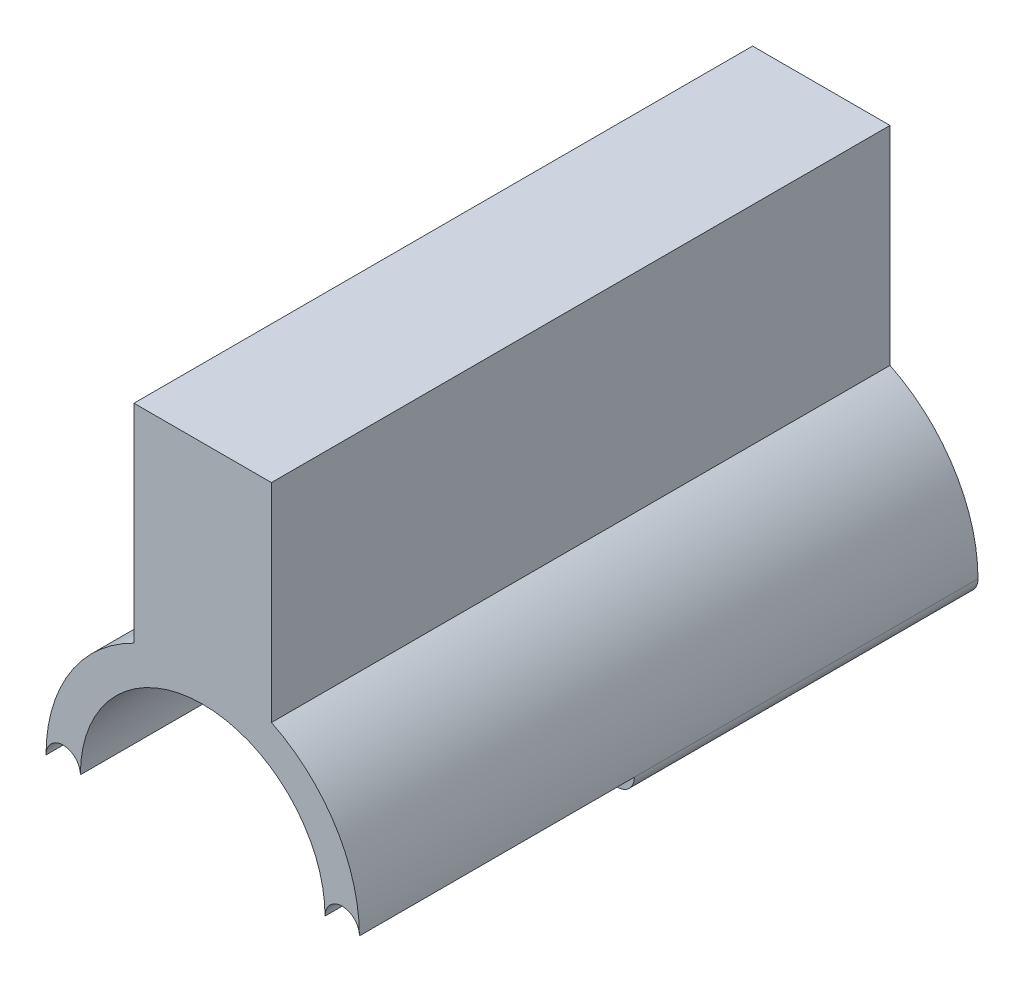
ISO-10303-21;
HEADER;
FILE_DESCRIPTION(('STEP AP214'),'2;1');
FILE_NAME('part.step','',(''),(''),'','','');
FILE_SCHEMA(('AUTOMOTIVE_DESIGN { 1 0 10303 214 1 1 1 1 }'));
ENDSEC;
DATA;
#1=APPLICATION_CONTEXT('core data for automotive mechanical design processes');
#2=APPLICATION_PROTOCOL_DEFINITION('international standard','automotive_design',2000,#1);
#3=PRODUCT_CONTEXT('',#1,'mechanical');
#4=PRODUCT('Part','Part','',(#3));
#5=PRODUCT_RELATED_PRODUCT_CATEGORY('part','',(#4));
#6=PRODUCT_DEFINITION_FORMATION('','',#4);
#7=PRODUCT_DEFINITION_CONTEXT('part definition',#1,'design');
#8=PRODUCT_DEFINITION('design','',#6,#7);
#9=PRODUCT_DEFINITION_SHAPE('','',#8);
#10=(LENGTH_UNIT() NAMED_UNIT(*) SI_UNIT(.MILLI.,.METRE.));
#11=(NAMED_UNIT(*) PLANE_ANGLE_UNIT() SI_UNIT($,.RADIAN.));
#12=(NAMED_UNIT(*) SI_UNIT($,.STERADIAN.) SOLID_ANGLE_UNIT());
#13=UNCERTAINTY_MEASURE_WITH_UNIT(LENGTH_MEASURE(1.E-05),#10,'distance_accuracy_value','');
#14=(GEOMETRIC_REPRESENTATION_CONTEXT(3) GLOBAL_UNCERTAINTY_ASSIGNED_CONTEXT((#13)) GLOBAL_UNIT_ASSIGNED_CONTEXT((#10,
#11,#12)) REPRESENTATION_CONTEXT('',''));
#15=CARTESIAN_POINT('',(0.,0.,0.));
#16=DIRECTION('',(0.,0.,1.));
#17=DIRECTION('',(1.,0.,0.));
#18=AXIS2_PLACEMENT_3D('',#15,#16,#17);
#19=CARTESIAN_POINT('',(-101.5,0.,450.));
#20=DIRECTION('',(0.,0.,-1.));
#21=DIRECTION('',(-1.,0.,0.));
#22=AXIS2_PLACEMENT_3D('',#19,#20,#21);
#23=CYLINDRICAL_SURFACE('',#22,12.5);
#24=CARTESIAN_POINT('',(-101.5,0.,250.));
#25=DIRECTION('',(0.,0.,1.));
#26=DIRECTION('',(1.,0.,0.));
#27=AXIS2_PLACEMENT_3D('',#24,#25,#26);
#28=CIRCLE('',#27,12.5);
#29=CARTESIAN_POINT('',(-114.,0.,250.));
#30=VERTEX_POINT('',#29);
#31=CARTESIAN_POINT('',(-89.,0.,250.));
#32=VERTEX_POINT('',#31);
#33=EDGE_CURVE('E185',#30,#32,#28,.T.);
#34=ORIENTED_EDGE('',*,*,#33,.F.);
#35=DIRECTION('',(0.,0.,-1.));
#36=VECTOR('',#35,1.);
#37=CARTESIAN_POINT('',(-114.,0.,450.));
#38=LINE('',#37,#36);
#39=CARTESIAN_POINT('',(-114.,0.,0.));
#40=VERTEX_POINT('',#39);
#41=EDGE_CURVE('E169',#30,#40,#38,.T.);
#42=ORIENTED_EDGE('',*,*,#41,.T.);
#43=CARTESIAN_POINT('',(-101.5,0.,0.));
#44=DIRECTION('',(0.,0.,1.));
#45=DIRECTION('',(1.,0.,0.));
#46=AXIS2_PLACEMENT_3D('',#43,#44,#45);
#47=CIRCLE('',#46,12.5);
#48=CARTESIAN_POINT('',(-89.,0.,0.));
#49=VERTEX_POINT('',#48);
#50=EDGE_CURVE('E143',#40,#49,#47,.T.);
#51=ORIENTED_EDGE('',*,*,#50,.T.);
#52=DIRECTION('',(0.,0.,-1.));
#53=VECTOR('',#52,1.);
#54=CARTESIAN_POINT('',(-89.,0.,450.));
#55=LINE('',#54,#53);
#56=EDGE_CURVE('E164',#32,#49,#55,.T.);
#57=ORIENTED_EDGE('',*,*,#56,.F.);
#58=EDGE_LOOP('',(#34,#42,#51,#57));
#59=FACE_BOUND('',#58,.T.);
#60=ADVANCED_FACE('F41',(#59),#23,.T.);
#61=CARTESIAN_POINT('',(101.5,0.,450.));
#62=DIRECTION('',(0.,0.,-1.));
#63=DIRECTION('',(-1.,0.,0.));
#64=AXIS2_PLACEMENT_3D('',#61,#62,#63);
#65=CYLINDRICAL_SURFACE('',#64,12.5);
#66=CARTESIAN_POINT('',(101.5,0.,250.));
#67=DIRECTION('',(0.,0.,1.));
#68=DIRECTION('',(1.,0.,0.));
#69=AXIS2_PLACEMENT_3D('',#66,#67,#68);
#70=CIRCLE('',#69,12.5);
#71=CARTESIAN_POINT('',(89.,0.,250.));
#72=VERTEX_POINT('',#71);
#73=CARTESIAN_POINT('',(114.,0.,250.));
#74=VERTEX_POINT('',#73);
#75=EDGE_CURVE('E208',#72,#74,#70,.T.);
#76=ORIENTED_EDGE('',*,*,#75,.F.);
#77=DIRECTION('',(0.,0.,-1.));
#78=VECTOR('',#77,1.);
#79=CARTESIAN_POINT('',(89.,0.,450.));
#80=LINE('',#79,#78);
#81=CARTESIAN_POINT('',(89.,0.,0.));
#82=VERTEX_POINT('',#81);
#83=EDGE_CURVE('E161',#72,#82,#80,.T.);
#84=ORIENTED_EDGE('',*,*,#83,.T.);
#85=CARTESIAN_POINT('',(101.5,0.,0.));
#86=DIRECTION('',(0.,0.,1.));
#87=DIRECTION('',(1.,0.,0.));
#88=AXIS2_PLACEMENT_3D('',#85,#86,#87);
#89=CIRCLE('',#88,12.5);
#90=CARTESIAN_POINT('',(114.,0.,0.));
#91=VERTEX_POINT('',#90);
#92=EDGE_CURVE('E150',#82,#91,#89,.T.);
#93=ORIENTED_EDGE('',*,*,#92,.T.);
#94=DIRECTION('',(0.,0.,-1.));
#95=VECTOR('',#94,1.);
#96=CARTESIAN_POINT('',(114.,0.,450.));
#97=LINE('',#96,#95);
#98=EDGE_CURVE('E130',#74,#91,#97,.T.);
#99=ORIENTED_EDGE('',*,*,#98,.F.);
#100=EDGE_LOOP('',(#76,#84,#93,#99));
#101=FACE_BOUND('',#100,.T.);
#102=ADVANCED_FACE('F217',(#101),#65,.T.);
#103=CARTESIAN_POINT('',(-50.,0.,450.));
#104=DIRECTION('',(-1.,0.,0.));
#105=DIRECTION('',(0.,0.,1.));
#106=AXIS2_PLACEMENT_3D('',#103,#104,#105);
#107=PLANE('',#106);
#108=DIRECTION('',(0.,1.,0.));
#109=VECTOR('',#108,1.);
#110=CARTESIAN_POINT('',(-50.,0.,0.));
#111=LINE('',#110,#109);
#112=CARTESIAN_POINT('',(-50.,102.449987798926,0.));
#113=VERTEX_POINT('',#112);
#114=CARTESIAN_POINT('',(-50.,253.6274405368,0.));
#115=VERTEX_POINT('',#114);
#116=EDGE_CURVE('E135',#113,#115,#111,.T.);
#117=ORIENTED_EDGE('',*,*,#116,.F.);
#118=DIRECTION('',(0.,0.,-1.));
#119=VECTOR('',#118,1.);
#120=CARTESIAN_POINT('',(-50.,102.449987798926,450.));
#121=LINE('',#120,#119);
#122=CARTESIAN_POINT('',(-50.,102.449987798926,450.));
#123=VERTEX_POINT('',#122);
#124=EDGE_CURVE('E11',#123,#113,#121,.T.);
#125=ORIENTED_EDGE('',*,*,#124,.F.);
#126=DIRECTION('',(0.,1.,0.));
#127=VECTOR('',#126,1.);
#128=CARTESIAN_POINT('',(-50.,0.,450.));
#129=LINE('',#128,#127);
#130=CARTESIAN_POINT('',(-50.,253.6274405368,450.));
#131=VERTEX_POINT('',#130);
#132=EDGE_CURVE('E156',#123,#131,#129,.T.);
#133=ORIENTED_EDGE('',*,*,#132,.T.);
#134=DIRECTION('',(0.,0.,-1.));
#135=VECTOR('',#134,1.);
#136=CARTESIAN_POINT('',(-50.,253.6274405368,450.));
#137=LINE('',#136,#135);
#138=EDGE_CURVE('E59',#131,#115,#137,.T.);
#139=ORIENTED_EDGE('',*,*,#138,.T.);
#140=EDGE_LOOP('',(#117,#125,#133,#139));
#141=FACE_BOUND('',#140,.T.);
#142=ADVANCED_FACE('F43',(#141),#107,.T.);
#143=CARTESIAN_POINT('',(0.,0.,450.));
#144=DIRECTION('',(0.,0.,-1.));
#145=DIRECTION('',(-1.,0.,0.));
#146=AXIS2_PLACEMENT_3D('',#143,#144,#145);
#147=CYLINDRICAL_SURFACE('',#146,114.);
#148=CARTESIAN_POINT('',(0.,0.,0.));
#149=DIRECTION('',(0.,0.,1.));
#150=DIRECTION('',(1.,0.,0.));
#151=AXIS2_PLACEMENT_3D('',#148,#149,#150);
#152=CIRCLE('',#151,114.);
#153=EDGE_CURVE('E140',#113,#40,#152,.T.);
#154=ORIENTED_EDGE('',*,*,#153,.T.);
#155=ORIENTED_EDGE('',*,*,#41,.F.);
#156=CARTESIAN_POINT('',(-114.,0.,450.));
#157=VERTEX_POINT('',#156);
#158=EDGE_CURVE('E49',#157,#30,#38,.T.);
#159=ORIENTED_EDGE('',*,*,#158,.F.);
#160=CARTESIAN_POINT('',(0.,0.,450.));
#161=DIRECTION('',(0.,0.,1.));
#162=DIRECTION('',(1.,0.,0.));
#163=AXIS2_PLACEMENT_3D('',#160,#161,#162);
#164=CIRCLE('',#163,114.);
#165=EDGE_CURVE('E231',#123,#157,#164,.T.);
#166=ORIENTED_EDGE('',*,*,#165,.F.);
#167=ORIENTED_EDGE('',*,*,#124,.T.);
#168=EDGE_LOOP('',(#154,#155,#159,#166,#167));
#169=FACE_BOUND('',#168,.T.);
#170=ADVANCED_FACE('F183',(#169),#147,.T.);
#171=CARTESIAN_POINT('',(0.,0.,450.));
#172=DIRECTION('',(0.,0.,-1.));
#173=DIRECTION('',(-1.,0.,0.));
#174=AXIS2_PLACEMENT_3D('',#171,#172,#173);
#175=CYLINDRICAL_SURFACE('',#174,89.);
#176=CARTESIAN_POINT('',(0.,0.,0.));
#177=DIRECTION('',(0.,0.,1.));
#178=DIRECTION('',(1.,0.,0.));
#179=AXIS2_PLACEMENT_3D('',#176,#177,#178);
#180=CIRCLE('',#179,89.);
#181=EDGE_CURVE('E145',#82,#49,#180,.T.);
#182=ORIENTED_EDGE('',*,*,#181,.F.);
#183=ORIENTED_EDGE('',*,*,#83,.F.);
#184=CARTESIAN_POINT('',(89.,0.,450.));
#185=VERTEX_POINT('',#184);
#186=EDGE_CURVE('E165',#185,#72,#80,.T.);
#187=ORIENTED_EDGE('',*,*,#186,.F.);
#188=CARTESIAN_POINT('',(0.,0.,450.));
#189=DIRECTION('',(0.,0.,1.));
#190=DIRECTION('',(1.,0.,0.));
#191=AXIS2_PLACEMENT_3D('',#188,#189,#190);
#192=CIRCLE('',#191,89.);
#193=CARTESIAN_POINT('',(-89.,0.,450.));
#194=VERTEX_POINT('',#193);
#195=EDGE_CURVE('E119',#185,#194,#192,.T.);
#196=ORIENTED_EDGE('',*,*,#195,.T.);
#197=EDGE_CURVE('E167',#194,#32,#55,.T.);
#198=ORIENTED_EDGE('',*,*,#197,.T.);
#199=ORIENTED_EDGE('',*,*,#56,.T.);
#200=EDGE_LOOP('',(#182,#183,#187,#196,#198,#199));
#201=FACE_BOUND('',#200,.T.);
#202=ADVANCED_FACE('F195',(#201),#175,.F.);
#203=CARTESIAN_POINT('',(0.,0.,450.));
#204=DIRECTION('',(0.,0.,-1.));
#205=DIRECTION('',(-1.,0.,0.));
#206=AXIS2_PLACEMENT_3D('',#203,#204,#205);
#207=CYLINDRICAL_SURFACE('',#206,114.);
#208=CARTESIAN_POINT('',(0.,0.,0.));
#209=DIRECTION('',(0.,0.,1.));
#210=DIRECTION('',(1.,0.,0.));
#211=AXIS2_PLACEMENT_3D('',#208,#209,#210);
#212=CIRCLE('',#211,114.);
#213=CARTESIAN_POINT('',(50.,102.449987798926,0.));
#214=VERTEX_POINT('',#213);
#215=EDGE_CURVE('E122',#91,#214,#212,.T.);
#216=ORIENTED_EDGE('',*,*,#215,.T.);
#217=DIRECTION('',(0.,0.,-1.));
#218=VECTOR('',#217,1.);
#219=CARTESIAN_POINT('',(50.,102.449987798926,450.));
#220=LINE('',#219,#218);
#221=CARTESIAN_POINT('',(50.,102.449987798926,450.));
#222=VERTEX_POINT('',#221);
#223=EDGE_CURVE('E121',#222,#214,#220,.T.);
#224=ORIENTED_EDGE('',*,*,#223,.F.);
#225=CARTESIAN_POINT('',(0.,0.,450.));
#226=DIRECTION('',(0.,0.,1.));
#227=DIRECTION('',(1.,0.,0.));
#228=AXIS2_PLACEMENT_3D('',#225,#226,#227);
#229=CIRCLE('',#228,114.);
#230=CARTESIAN_POINT('',(114.,0.,450.));
#231=VERTEX_POINT('',#230);
#232=EDGE_CURVE('E106',#231,#222,#229,.T.);
#233=ORIENTED_EDGE('',*,*,#232,.F.);
#234=EDGE_CURVE('E157',#231,#74,#97,.T.);
#235=ORIENTED_EDGE('',*,*,#234,.T.);
#236=ORIENTED_EDGE('',*,*,#98,.T.);
#237=EDGE_LOOP('',(#216,#224,#233,#235,#236));
#238=FACE_BOUND('',#237,.T.);
#239=ADVANCED_FACE('F125',(#238),#207,.T.);
#240=CARTESIAN_POINT('',(50.,0.,450.));
#241=DIRECTION('',(1.,0.,0.));
#242=DIRECTION('',(0.,1.,0.));
#243=AXIS2_PLACEMENT_3D('',#240,#241,#242);
#244=PLANE('',#243);
#245=DIRECTION('',(0.,-1.,0.));
#246=VECTOR('',#245,1.);
#247=CARTESIAN_POINT('',(50.,0.,0.));
#248=LINE('',#247,#246);
#249=CARTESIAN_POINT('',(50.,253.6274405368,0.));
#250=VERTEX_POINT('',#249);
#251=EDGE_CURVE('E151',#250,#214,#248,.T.);
#252=ORIENTED_EDGE('',*,*,#251,.F.);
#253=DIRECTION('',(0.,0.,-1.));
#254=VECTOR('',#253,1.);
#255=CARTESIAN_POINT('',(50.,253.6274405368,450.));
#256=LINE('',#255,#254);
#257=CARTESIAN_POINT('',(50.,253.6274405368,450.));
#258=VERTEX_POINT('',#257);
#259=EDGE_CURVE('E82',#258,#250,#256,.T.);
#260=ORIENTED_EDGE('',*,*,#259,.F.);
#261=DIRECTION('',(0.,-1.,0.));
#262=VECTOR('',#261,1.);
#263=CARTESIAN_POINT('',(50.,0.,450.));
#264=LINE('',#263,#262);
#265=EDGE_CURVE('E115',#258,#222,#264,.T.);
#266=ORIENTED_EDGE('',*,*,#265,.T.);
#267=ORIENTED_EDGE('',*,*,#223,.T.);
#268=EDGE_LOOP('',(#252,#260,#266,#267));
#269=FACE_BOUND('',#268,.T.);
#270=ADVANCED_FACE('F129',(#269),#244,.T.);
#271=CARTESIAN_POINT('',(0.,253.6274405368,450.));
#272=DIRECTION('',(0.,1.,0.));
#273=DIRECTION('',(0.,0.,1.));
#274=AXIS2_PLACEMENT_3D('',#271,#272,#273);
#275=PLANE('',#274);
#276=DIRECTION('',(1.,0.,0.));
#277=VECTOR('',#276,1.);
#278=CARTESIAN_POINT('',(0.,253.6274405368,0.));
#279=LINE('',#278,#277);
#280=EDGE_CURVE('E153',#115,#250,#279,.T.);
#281=ORIENTED_EDGE('',*,*,#280,.F.);
#282=ORIENTED_EDGE('',*,*,#138,.F.);
#283=DIRECTION('',(1.,0.,0.));
#284=VECTOR('',#283,1.);
#285=CARTESIAN_POINT('',(0.,253.6274405368,450.));
#286=LINE('',#285,#284);
#287=EDGE_CURVE('E128',#131,#258,#286,.T.);
#288=ORIENTED_EDGE('',*,*,#287,.T.);
#289=ORIENTED_EDGE('',*,*,#259,.T.);
#290=EDGE_LOOP('',(#281,#282,#288,#289));
#291=FACE_BOUND('',#290,.T.);
#292=ADVANCED_FACE('F270',(#291),#275,.T.);
#293=CARTESIAN_POINT('',(0.,0.,450.));
#294=DIRECTION('',(0.,0.,1.));
#295=DIRECTION('',(1.,0.,0.));
#296=AXIS2_PLACEMENT_3D('',#293,#294,#295);
#297=PLANE('',#296);
#298=CARTESIAN_POINT('',(-101.5,0.,450.));
#299=DIRECTION('',(0.,0.,1.));
#300=DIRECTION('',(1.,0.,0.));
#301=AXIS2_PLACEMENT_3D('',#298,#299,#300);
#302=CIRCLE('',#301,12.5);
#303=EDGE_CURVE('E233',#194,#157,#302,.T.);
#304=ORIENTED_EDGE('',*,*,#303,.F.);
#305=ORIENTED_EDGE('',*,*,#195,.F.);
#306=CARTESIAN_POINT('',(101.5,0.,450.));
#307=DIRECTION('',(0.,0.,1.));
#308=DIRECTION('',(1.,0.,0.));
#309=AXIS2_PLACEMENT_3D('',#306,#307,#308);
#310=CIRCLE('',#309,12.5);
#311=EDGE_CURVE('E113',#231,#185,#310,.T.);
#312=ORIENTED_EDGE('',*,*,#311,.F.);
#313=ORIENTED_EDGE('',*,*,#232,.T.);
#314=ORIENTED_EDGE('',*,*,#265,.F.);
#315=ORIENTED_EDGE('',*,*,#287,.F.);
#316=ORIENTED_EDGE('',*,*,#132,.F.);
#317=ORIENTED_EDGE('',*,*,#165,.T.);
#318=EDGE_LOOP('',(#304,#305,#312,#313,#314,#315,#316,#317));
#319=FACE_BOUND('',#318,.T.);
#320=ADVANCED_FACE('F108',(#319),#297,.T.);
#321=CARTESIAN_POINT('',(0.,0.,0.));
#322=DIRECTION('',(0.,0.,1.));
#323=DIRECTION('',(1.,0.,0.));
#324=AXIS2_PLACEMENT_3D('',#321,#322,#323);
#325=PLANE('',#324);
#326=ORIENTED_EDGE('',*,*,#116,.T.);
#327=ORIENTED_EDGE('',*,*,#280,.T.);
#328=ORIENTED_EDGE('',*,*,#251,.T.);
#329=ORIENTED_EDGE('',*,*,#215,.F.);
#330=ORIENTED_EDGE('',*,*,#92,.F.);
#331=ORIENTED_EDGE('',*,*,#181,.T.);
#332=ORIENTED_EDGE('',*,*,#50,.F.);
#333=ORIENTED_EDGE('',*,*,#153,.F.);
#334=EDGE_LOOP('',(#326,#327,#328,#329,#330,#331,#332,#333));
#335=FACE_BOUND('',#334,.T.);
#336=ADVANCED_FACE('F187',(#335),#325,.F.);
#337=CARTESIAN_POINT('',(-101.5,0.,250.));
#338=DIRECTION('',(0.,0.,1.));
#339=DIRECTION('',(1.,0.,0.));
#340=AXIS2_PLACEMENT_3D('',#337,#338,#339);
#341=CYLINDRICAL_SURFACE('',#340,12.5);
#342=EDGE_CURVE('E228',#32,#30,#28,.T.);
#343=ORIENTED_EDGE('',*,*,#342,.F.);
#344=ORIENTED_EDGE('',*,*,#197,.F.);
#345=ORIENTED_EDGE('',*,*,#303,.T.);
#346=ORIENTED_EDGE('',*,*,#158,.T.);
#347=EDGE_LOOP('',(#343,#344,#345,#346));
#348=FACE_BOUND('',#347,.T.);
#349=ADVANCED_FACE('F239',(#348),#341,.F.);
#350=CARTESIAN_POINT('',(-101.5,0.,250.));
#351=DIRECTION('',(0.,0.,1.));
#352=DIRECTION('',(1.,0.,0.));
#353=AXIS2_PLACEMENT_3D('',#350,#351,#352);
#354=PLANE('',#353);
#355=CARTESIAN_POINT('',(-101.5,0.,250.));
#356=DIRECTION('',(0.,0.,1.));
#357=DIRECTION('',(1.,0.,0.));
#358=AXIS2_PLACEMENT_3D('',#355,#356,#357);
#359=CIRCLE('',#358,7.50000000000001);
#360=CARTESIAN_POINT('',(-94.,0.,250.));
#361=VERTEX_POINT('',#360);
#362=EDGE_CURVE('E214',#361,#361,#359,.T.);
#363=ORIENTED_EDGE('',*,*,#362,.F.);
#364=EDGE_LOOP('',(#363));
#365=FACE_BOUND('',#364,.T.);
#366=ORIENTED_EDGE('',*,*,#342,.T.);
#367=ORIENTED_EDGE('',*,*,#33,.T.);
#368=EDGE_LOOP('',(#366,#367));
#369=FACE_BOUND('',#368,.T.);
#370=ADVANCED_FACE('F236',(#365,#369),#354,.T.);
#371=CARTESIAN_POINT('',(101.5,0.,250.));
#372=DIRECTION('',(0.,0.,1.));
#373=DIRECTION('',(1.,0.,0.));
#374=AXIS2_PLACEMENT_3D('',#371,#372,#373);
#375=CYLINDRICAL_SURFACE('',#374,12.5);
#376=EDGE_CURVE('E215',#74,#72,#70,.T.);
#377=ORIENTED_EDGE('',*,*,#376,.F.);
#378=ORIENTED_EDGE('',*,*,#234,.F.);
#379=ORIENTED_EDGE('',*,*,#311,.T.);
#380=ORIENTED_EDGE('',*,*,#186,.T.);
#381=EDGE_LOOP('',(#377,#378,#379,#380));
#382=FACE_BOUND('',#381,.T.);
#383=ADVANCED_FACE('F211',(#382),#375,.F.);
#384=CARTESIAN_POINT('',(101.5,0.,250.));
#385=DIRECTION('',(0.,0.,1.));
#386=DIRECTION('',(1.,0.,0.));
#387=AXIS2_PLACEMENT_3D('',#384,#385,#386);
#388=PLANE('',#387);
#389=CARTESIAN_POINT('',(101.5,0.,250.));
#390=DIRECTION('',(0.,0.,1.));
#391=DIRECTION('',(1.,0.,0.));
#392=AXIS2_PLACEMENT_3D('',#389,#390,#391);
#393=CIRCLE('',#392,7.50000000000001);
#394=CARTESIAN_POINT('',(109.,0.,250.));
#395=VERTEX_POINT('',#394);
#396=EDGE_CURVE('E218',#395,#395,#393,.T.);
#397=ORIENTED_EDGE('',*,*,#396,.F.);
#398=EDGE_LOOP('',(#397));
#399=FACE_BOUND('',#398,.T.);
#400=ORIENTED_EDGE('',*,*,#376,.T.);
#401=ORIENTED_EDGE('',*,*,#75,.T.);
#402=EDGE_LOOP('',(#400,#401));
#403=FACE_BOUND('',#402,.T.);
#404=ADVANCED_FACE('F212',(#399,#403),#388,.T.);
#405=CARTESIAN_POINT('',(-101.5,0.,100.));
#406=DIRECTION('',(0.,0.,1.));
#407=DIRECTION('',(1.,0.,0.));
#408=AXIS2_PLACEMENT_3D('',#405,#406,#407);
#409=PLANE('',#408);
#410=CARTESIAN_POINT('',(-101.5,0.,100.));
#411=DIRECTION('',(0.,0.,1.));
#412=DIRECTION('',(1.,0.,0.));
#413=AXIS2_PLACEMENT_3D('',#410,#411,#412);
#414=CIRCLE('',#413,7.50000000000001);
#415=CARTESIAN_POINT('',(-94.,0.,100.));
#416=VERTEX_POINT('',#415);
#417=EDGE_CURVE('E138',#416,#416,#414,.T.);
#418=ORIENTED_EDGE('',*,*,#417,.T.);
#419=EDGE_LOOP('',(#418));
#420=FACE_BOUND('',#419,.T.);
#421=ADVANCED_FACE('F325',(#420),#409,.T.);
#422=CARTESIAN_POINT('',(-101.5,0.,100.));
#423=DIRECTION('',(0.,0.,1.));
#424=DIRECTION('',(1.,0.,0.));
#425=AXIS2_PLACEMENT_3D('',#422,#423,#424);
#426=CYLINDRICAL_SURFACE('',#425,7.50000000000001);
#427=ORIENTED_EDGE('',*,*,#417,.F.);
#428=EDGE_LOOP('',(#427));
#429=FACE_BOUND('',#428,.T.);
#430=ORIENTED_EDGE('',*,*,#362,.T.);
#431=EDGE_LOOP('',(#430));
#432=FACE_BOUND('',#431,.T.);
#433=ADVANCED_FACE('F316',(#429,#432),#426,.F.);
#434=CARTESIAN_POINT('',(101.5,0.,100.));
#435=DIRECTION('',(0.,0.,1.));
#436=DIRECTION('',(1.,0.,0.));
#437=AXIS2_PLACEMENT_3D('',#434,#435,#436);
#438=PLANE('',#437);
#439=CARTESIAN_POINT('',(101.5,0.,100.));
#440=DIRECTION('',(0.,0.,1.));
#441=DIRECTION('',(1.,0.,0.));
#442=AXIS2_PLACEMENT_3D('',#439,#440,#441);
#443=CIRCLE('',#442,7.50000000000001);
#444=CARTESIAN_POINT('',(109.,0.,100.));
#445=VERTEX_POINT('',#444);
#446=EDGE_CURVE('E226',#445,#445,#443,.T.);
#447=ORIENTED_EDGE('',*,*,#446,.T.);
#448=EDGE_LOOP('',(#447));
#449=FACE_BOUND('',#448,.T.);
#450=ADVANCED_FACE('F313',(#449),#438,.T.);
#451=CARTESIAN_POINT('',(101.5,0.,100.));
#452=DIRECTION('',(0.,0.,1.));
#453=DIRECTION('',(1.,0.,0.));
#454=AXIS2_PLACEMENT_3D('',#451,#452,#453);
#455=CYLINDRICAL_SURFACE('',#454,7.50000000000001);
#456=ORIENTED_EDGE('',*,*,#446,.F.);
#457=EDGE_LOOP('',(#456));
#458=FACE_BOUND('',#457,.T.);
#459=ORIENTED_EDGE('',*,*,#396,.T.);
#460=EDGE_LOOP('',(#459));
#461=FACE_BOUND('',#460,.T.);
#462=ADVANCED_FACE('F312',(#458,#461),#455,.F.);
#463=CLOSED_SHELL('',(#60,#102,#142,#170,#202,#239,#270,#292,#320,#336,#349,#370,#383,#404,#421,
#433,#450,#462));
#464=MANIFOLD_SOLID_BREP('B2',#463);
#465=ADVANCED_BREP_SHAPE_REPRESENTATION('',(#18,#464),#14);
#466=SHAPE_DEFINITION_REPRESENTATION(#9,#465);
ENDSEC;
END-ISO-10303-21;
